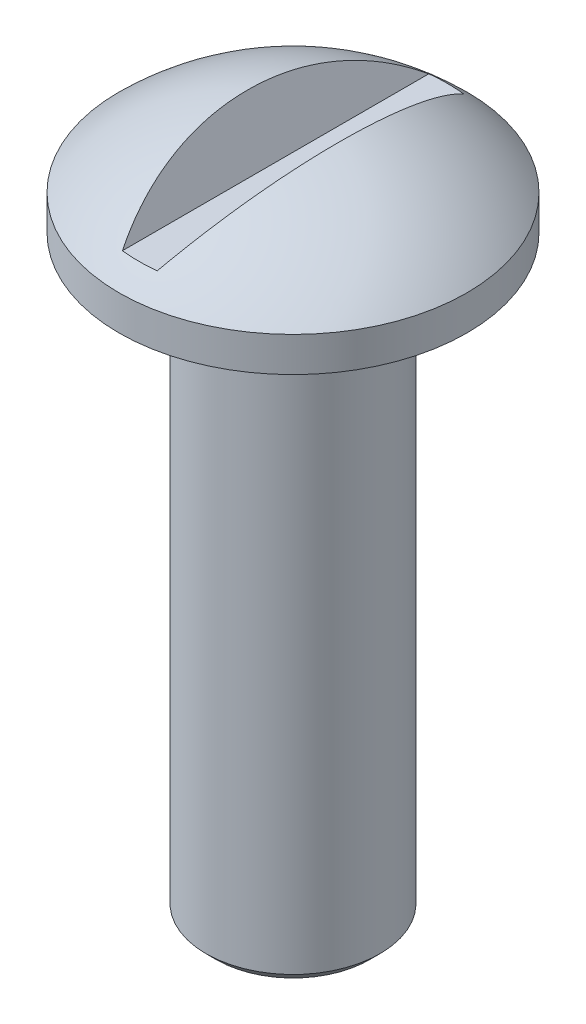
ISO-10303-21;
HEADER;
FILE_DESCRIPTION(('STEP AP214'),'2;1');
FILE_NAME('part.step','',(''),(''),'','','');
FILE_SCHEMA(('AUTOMOTIVE_DESIGN { 1 0 10303 214 1 1 1 1 }'));
ENDSEC;
DATA;
#1=APPLICATION_CONTEXT('core data for automotive mechanical design processes');
#2=APPLICATION_PROTOCOL_DEFINITION('international standard','automotive_design',2000,#1);
#3=PRODUCT_CONTEXT('',#1,'mechanical');
#4=PRODUCT('Part','Part','',(#3));
#5=PRODUCT_RELATED_PRODUCT_CATEGORY('part','',(#4));
#6=PRODUCT_DEFINITION_FORMATION('','',#4);
#7=PRODUCT_DEFINITION_CONTEXT('part definition',#1,'design');
#8=PRODUCT_DEFINITION('design','',#6,#7);
#9=PRODUCT_DEFINITION_SHAPE('','',#8);
#10=(LENGTH_UNIT() NAMED_UNIT(*) SI_UNIT(.MILLI.,.METRE.));
#11=(NAMED_UNIT(*) PLANE_ANGLE_UNIT() SI_UNIT($,.RADIAN.));
#12=(NAMED_UNIT(*) SI_UNIT($,.STERADIAN.) SOLID_ANGLE_UNIT());
#13=UNCERTAINTY_MEASURE_WITH_UNIT(LENGTH_MEASURE(1.E-05),#10,'distance_accuracy_value','');
#14=(GEOMETRIC_REPRESENTATION_CONTEXT(3) GLOBAL_UNCERTAINTY_ASSIGNED_CONTEXT((#13)) GLOBAL_UNIT_ASSIGNED_CONTEXT((#10,
#11,#12)) REPRESENTATION_CONTEXT('',''));
#15=CARTESIAN_POINT('',(0.,0.,0.));
#16=DIRECTION('',(0.,0.,1.));
#17=DIRECTION('',(1.,0.,0.));
#18=AXIS2_PLACEMENT_3D('',#15,#16,#17);
#19=CARTESIAN_POINT('',(0.,-10.1581751781052,0.));
#20=DIRECTION('',(0.,-1.,0.));
#21=DIRECTION('',(0.,0.,-1.));
#22=AXIS2_PLACEMENT_3D('',#19,#20,#21);
#23=DEGENERATE_TOROIDAL_SURFACE('',#22,0.25472992875793,17.78,.T.);
#24=CARTESIAN_POINT('',(0.,2.54,0.));
#25=DIRECTION('',(0.,-1.,0.));
#26=DIRECTION('',(0.,0.,-1.));
#27=AXIS2_PLACEMENT_3D('',#24,#25,#26);
#28=CIRCLE('',#27,12.7);
#29=CARTESIAN_POINT('',(0.,2.54,-12.7));
#30=VERTEX_POINT('',#29);
#31=EDGE_CURVE('E131',#30,#30,#28,.T.);
#32=ORIENTED_EDGE('',*,*,#31,.F.);
#33=EDGE_LOOP('',(#32));
#34=FACE_BOUND('',#33,.T.);
#35=CARTESIAN_POINT('',(-1.26883096853396,3.80797517810517,11.1864111993119));
#36=CARTESIAN_POINT('',(-1.42347276021877,4.07582261827674,10.8267974803934));
#37=CARTESIAN_POINT('',(-1.57046619824696,4.3304227213208,10.4540787824871));
#38=CARTESIAN_POINT('',(-1.84820938772054,4.81148803694528,9.68522218890252));
#39=CARTESIAN_POINT('',(-1.97896063963042,5.03795584840642,9.28908646150319));
#40=CARTESIAN_POINT('',(-2.22292123203513,5.46050798949597,8.47738400095323));
#41=CARTESIAN_POINT('',(-2.3361838952831,5.65668467684203,8.06188157164215));
#42=CARTESIAN_POINT('',(-2.4926739960017,5.9277334821682,7.42560613299783));
#43=CARTESIAN_POINT('',(-2.54260559247814,6.01421754416842,7.21133272371797));
#44=CARTESIAN_POINT('',(-2.63794414544133,6.17934876182076,6.77873424335938));
#45=CARTESIAN_POINT('',(-2.68334999701214,6.25799400370234,6.5604081982274));
#46=CARTESIAN_POINT('',(-2.81277225322966,6.48215992710129,5.89934502235263));
#47=CARTESIAN_POINT('',(-2.88985462598748,6.61567051308579,5.45108715456467));
#48=CARTESIAN_POINT('',(-3.02504316315355,6.84982392805834,4.54332429483763));
#49=CARTESIAN_POINT('',(-3.08314890147466,6.9504660190418,4.08381905060735));
#50=CARTESIAN_POINT('',(-3.18022266220742,7.11860270471272,3.15647063728677));
#51=CARTESIAN_POINT('',(-3.21917728472285,7.18607409009912,2.68862186680724));
#52=CARTESIAN_POINT('',(-3.27801541679004,7.28798472426193,1.74808156633599));
#53=CARTESIAN_POINT('',(-3.29789694040104,7.32242053328807,1.27538953722934));
#54=CARTESIAN_POINT('',(-3.31381614723032,7.34999340833258,0.55946472882301));
#55=CARTESIAN_POINT('',(-3.31675384536018,7.3550816507508,0.316766531961293));
#56=CARTESIAN_POINT('',(-3.31774742199012,7.35680257595506,-0.168665863024643));
#57=CARTESIAN_POINT('',(-3.31580336131507,7.35343536409287,-0.411400060662626));
#58=CARTESIAN_POINT('',(-3.30262273521215,7.33060585000705,-1.13904778834627));
#59=CARTESIAN_POINT('',(-3.28404020120777,7.2984199569781,-1.62351782350344));
#60=CARTESIAN_POINT('',(-3.22688182370829,7.19941874307079,-2.58778400369041));
#61=CARTESIAN_POINT('',(-3.18830215324768,7.13259679369376,-3.06757923616424));
#62=CARTESIAN_POINT('',(-3.0909837950158,6.96403645272694,-4.01892754744355));
#63=CARTESIAN_POINT('',(-3.03224613308829,6.8622998379507,-4.4904810443893));
#64=CARTESIAN_POINT('',(-2.89339235022734,6.62179803121239,-5.43151959055072));
#65=CARTESIAN_POINT('',(-2.81285676285247,6.48230630206172,-5.90075736629917));
#66=CARTESIAN_POINT('',(-2.6314853205003,6.16816174886571,-6.82338864478293));
#67=CARTESIAN_POINT('',(-2.53064533905391,5.99350177756626,-7.27677890480518));
#68=CARTESIAN_POINT('',(-2.30960426192462,5.61064740141858,-8.16326072799721));
#69=CARTESIAN_POINT('',(-2.18943721832486,5.40251197650844,-8.59638629371309));
#70=CARTESIAN_POINT('',(-1.93057009835064,4.95414097230407,-9.43960734072317));
#71=CARTESIAN_POINT('',(-1.79188193164166,4.71392602115555,-9.84971738302614));
#72=CARTESIAN_POINT('',(-1.58466061492596,4.35500817219263,-10.407859369777));
#73=CARTESIAN_POINT('',(-1.52339588609541,4.24889454914618,-10.5668490701742));
#74=CARTESIAN_POINT('',(-1.39815019390004,4.03196264683467,-10.8801300024231));
#75=CARTESIAN_POINT('',(-1.33417309803046,3.92115106626786,-11.0344274189524));
#76=CARTESIAN_POINT('',(-1.26883096853396,3.80797517810518,-11.1864111993119));
#77=B_SPLINE_CURVE_WITH_KNOTS('',3,(#35,#36,#37,#38,#39,#40,#41,#42,#43,#44,#45,#46,#47,#48,#49,
#50,#51,#52,#53,#54,#55,#56,#57,#58,#59,#60,#61,#62,#63,#64,#65,#66,#67,#68,#69,#70,#71,#72,#73,
#74,#75,#76),.UNSPECIFIED.,.F.,.F.,(4,2,2,2,2,2,2,2,2,2,2,2,2,2,2,2,2,2,2,2,4),(0.,
1.42246330577495,2.84479510551733,4.26270072849486,4.97172610332652,5.68092415787419,
7.1012007437598,8.52150921728075,9.94281006092002,11.3642588780492,12.0923968429781,
12.8205257356278,14.2764500532682,15.7326531023375,17.1887820559606,18.6752143922294,
20.1619491221205,21.6460925258543,23.1292861330814,23.7313636168075,24.3326097288373),.UNSPECIFIED.);
#78=CARTESIAN_POINT('',(-1.27,3.81,11.1836915168376));
#79=VERTEX_POINT('',#78);
#80=CARTESIAN_POINT('',(-1.27,3.81,-11.1836915168376));
#81=VERTEX_POINT('',#80);
#82=EDGE_CURVE('E83',#79,#81,#77,.T.);
#83=ORIENTED_EDGE('',*,*,#82,.T.);
#84=CARTESIAN_POINT('',(0.,3.81,0.));
#85=DIRECTION('',(0.,1.,0.));
#86=DIRECTION('',(0.,0.,1.));
#87=AXIS2_PLACEMENT_3D('',#84,#85,#86);
#88=CIRCLE('',#87,11.2555699963967);
#89=CARTESIAN_POINT('',(1.27,3.81,-11.1836915168376));
#90=VERTEX_POINT('',#89);
#91=EDGE_CURVE('E69',#81,#90,#88,.F.);
#92=ORIENTED_EDGE('',*,*,#91,.T.);
#93=CARTESIAN_POINT('',(1.26883096853396,3.80797517810517,-11.1864111993119));
#94=CARTESIAN_POINT('',(1.42347276021877,4.07582261827674,-10.8267974803934));
#95=CARTESIAN_POINT('',(1.57046619824696,4.3304227213208,-10.4540787824871));
#96=CARTESIAN_POINT('',(1.84820938772055,4.81148803694528,-9.68522218890252));
#97=CARTESIAN_POINT('',(1.97896063963042,5.03795584840642,-9.28908646150319));
#98=CARTESIAN_POINT('',(2.22292123203513,5.46050798949597,-8.47738400095323));
#99=CARTESIAN_POINT('',(2.3361838952831,5.65668467684203,-8.06188157164215));
#100=CARTESIAN_POINT('',(2.4926739960017,5.9277334821682,-7.42560613299783));
#101=CARTESIAN_POINT('',(2.54260559247814,6.01421754416842,-7.21133272371797));
#102=CARTESIAN_POINT('',(2.63794414544133,6.17934876182076,-6.77873424335938));
#103=CARTESIAN_POINT('',(2.68334999701214,6.25799400370234,-6.5604081982274));
#104=CARTESIAN_POINT('',(2.81277225322966,6.48215992710128,-5.89934502235263));
#105=CARTESIAN_POINT('',(2.88985462598748,6.61567051308579,-5.45108715456467));
#106=CARTESIAN_POINT('',(3.02504316315355,6.84982392805834,-4.54332429483763));
#107=CARTESIAN_POINT('',(3.08314890147466,6.9504660190418,-4.08381905060735));
#108=CARTESIAN_POINT('',(3.18022266220742,7.11860270471272,-3.15647063728678));
#109=CARTESIAN_POINT('',(3.21917728472285,7.18607409009912,-2.68862186680725));
#110=CARTESIAN_POINT('',(3.27801541679004,7.28798472426193,-1.748081566336));
#111=CARTESIAN_POINT('',(3.29789694040104,7.32242053328807,-1.27538953722935));
#112=CARTESIAN_POINT('',(3.31381614723032,7.34999340833258,-0.559464728823018));
#113=CARTESIAN_POINT('',(3.31675384536018,7.3550816507508,-0.316766531961302));
#114=CARTESIAN_POINT('',(3.31774742199012,7.35680257595506,0.168665863024634));
#115=CARTESIAN_POINT('',(3.31580336131507,7.35343536409287,0.411400060662617));
#116=CARTESIAN_POINT('',(3.30262273521215,7.33060585000705,1.13904778834626));
#117=CARTESIAN_POINT('',(3.28404020120777,7.2984199569781,1.62351782350343));
#118=CARTESIAN_POINT('',(3.22688182370829,7.19941874307079,2.5877840036904));
#119=CARTESIAN_POINT('',(3.18830215324769,7.13259679369377,3.06757923616423));
#120=CARTESIAN_POINT('',(3.0909837950158,6.96403645272695,4.01892754744354));
#121=CARTESIAN_POINT('',(3.03224613308829,6.8622998379507,4.49048104438928));
#122=CARTESIAN_POINT('',(2.89339235022734,6.6217980312124,5.43151959055071));
#123=CARTESIAN_POINT('',(2.81285676285248,6.48230630206172,5.90075736629916));
#124=CARTESIAN_POINT('',(2.63148532050031,6.16816174886572,6.82338864478292));
#125=CARTESIAN_POINT('',(2.53064533905392,5.99350177756627,7.27677890480517));
#126=CARTESIAN_POINT('',(2.30960426192463,5.61064740141859,8.1632607279972));
#127=CARTESIAN_POINT('',(2.18943721832486,5.40251197650845,8.59638629371308));
#128=CARTESIAN_POINT('',(1.93057009835064,4.95414097230408,9.43960734072316));
#129=CARTESIAN_POINT('',(1.79188193164167,4.71392602115555,9.84971738302613));
#130=CARTESIAN_POINT('',(1.58466061492597,4.35500817219264,10.4078593697769));
#131=CARTESIAN_POINT('',(1.52339588609541,4.24889454914619,10.5668490701742));
#132=CARTESIAN_POINT('',(1.39815019390004,4.03196264683467,10.8801300024231));
#133=CARTESIAN_POINT('',(1.33417309803047,3.92115106626786,11.0344274189524));
#134=CARTESIAN_POINT('',(1.26883096853396,3.80797517810517,11.1864111993119));
#135=B_SPLINE_CURVE_WITH_KNOTS('',3,(#93,#94,#95,#96,#97,#98,#99,#100,#101,#102,#103,#104,#105,
#106,#107,#108,#109,#110,#111,#112,#113,#114,#115,#116,#117,#118,#119,#120,#121,#122,#123,#124,
#125,#126,#127,#128,#129,#130,#131,#132,#133,#134),.UNSPECIFIED.,.F.,.F.,(4,2,2,2,2,2,2,2,2,2,2,
2,2,2,2,2,2,2,2,2,4),(0.,1.42246330577495,2.84479510551732,4.26270072849486,4.97172610332652,
5.68092415787419,7.1012007437598,8.52150921728074,9.94281006092001,11.3642588780492,
12.092396842978,12.8205257356278,14.2764500532681,15.7326531023375,17.1887820559606,
18.6752143922294,20.1619491221205,21.6460925258543,23.1292861330813,23.7313636168075,
24.3326097288373),.UNSPECIFIED.);
#136=CARTESIAN_POINT('',(1.27,3.81,11.1836915168376));
#137=VERTEX_POINT('',#136);
#138=EDGE_CURVE('E88',#90,#137,#135,.T.);
#139=ORIENTED_EDGE('',*,*,#138,.T.);
#140=EDGE_CURVE('E75',#137,#79,#88,.F.);
#141=ORIENTED_EDGE('',*,*,#140,.T.);
#142=EDGE_LOOP('',(#83,#92,#139,#141));
#143=FACE_BOUND('',#142,.T.);
#144=ADVANCED_FACE('F47',(#34,#143),#23,.T.);
#145=CARTESIAN_POINT('',(0.,7.62,0.));
#146=DIRECTION('',(0.,-1.,0.));
#147=DIRECTION('',(0.,0.,-1.));
#148=AXIS2_PLACEMENT_3D('',#145,#146,#147);
#149=CYLINDRICAL_SURFACE('',#148,12.7);
#150=CARTESIAN_POINT('',(0.,0.,0.));
#151=DIRECTION('',(0.,1.,0.));
#152=DIRECTION('',(0.,0.,1.));
#153=AXIS2_PLACEMENT_3D('',#150,#151,#152);
#154=CIRCLE('',#153,12.7);
#155=CARTESIAN_POINT('',(0.,0.,12.7));
#156=VERTEX_POINT('',#155);
#157=EDGE_CURVE('E134',#156,#156,#154,.T.);
#158=ORIENTED_EDGE('',*,*,#157,.T.);
#159=EDGE_LOOP('',(#158));
#160=FACE_BOUND('',#159,.T.);
#161=ORIENTED_EDGE('',*,*,#31,.T.);
#162=EDGE_LOOP('',(#161));
#163=FACE_BOUND('',#162,.T.);
#164=ADVANCED_FACE('F121',(#160,#163),#149,.T.);
#165=CARTESIAN_POINT('',(0.,-43.18,0.));
#166=DIRECTION('',(0.,1.,0.));
#167=DIRECTION('',(0.,0.,1.));
#168=AXIS2_PLACEMENT_3D('',#165,#166,#167);
#169=CYLINDRICAL_SURFACE('',#168,6.35);
#170=CARTESIAN_POINT('',(0.,-42.418,0.));
#171=DIRECTION('',(0.,1.,0.));
#172=DIRECTION('',(0.,0.,1.));
#173=AXIS2_PLACEMENT_3D('',#170,#171,#172);
#174=CIRCLE('',#173,6.35);
#175=CARTESIAN_POINT('',(0.,-42.418,6.35));
#176=VERTEX_POINT('',#175);
#177=EDGE_CURVE('E57',#176,#176,#174,.T.);
#178=ORIENTED_EDGE('',*,*,#177,.T.);
#179=EDGE_LOOP('',(#178));
#180=FACE_BOUND('',#179,.T.);
#181=CARTESIAN_POINT('',(0.,0.,0.));
#182=DIRECTION('',(0.,1.,0.));
#183=DIRECTION('',(0.,0.,1.));
#184=AXIS2_PLACEMENT_3D('',#181,#182,#183);
#185=CIRCLE('',#184,6.35);
#186=CARTESIAN_POINT('',(0.,0.,6.35));
#187=VERTEX_POINT('',#186);
#188=EDGE_CURVE('E84',#187,#187,#185,.T.);
#189=ORIENTED_EDGE('',*,*,#188,.F.);
#190=EDGE_LOOP('',(#189));
#191=FACE_BOUND('',#190,.T.);
#192=ADVANCED_FACE('F126',(#180,#191),#169,.T.);
#193=CARTESIAN_POINT('',(0.,-43.18,0.));
#194=DIRECTION('',(0.,1.,0.));
#195=DIRECTION('',(0.,0.,1.));
#196=AXIS2_PLACEMENT_3D('',#193,#194,#195);
#197=PLANE('',#196);
#198=CARTESIAN_POINT('',(0.,-43.18,0.));
#199=DIRECTION('',(0.,1.,0.));
#200=DIRECTION('',(0.,0.,1.));
#201=AXIS2_PLACEMENT_3D('',#198,#199,#200);
#202=CIRCLE('',#201,5.588);
#203=CARTESIAN_POINT('',(0.,-43.18,5.588));
#204=VERTEX_POINT('',#203);
#205=EDGE_CURVE('E11',#204,#204,#202,.F.);
#206=ORIENTED_EDGE('',*,*,#205,.T.);
#207=EDGE_LOOP('',(#206));
#208=FACE_BOUND('',#207,.T.);
#209=ADVANCED_FACE('F149',(#208),#197,.F.);
#210=CARTESIAN_POINT('',(0.,0.,0.));
#211=DIRECTION('',(0.,1.,0.));
#212=DIRECTION('',(0.,0.,1.));
#213=AXIS2_PLACEMENT_3D('',#210,#211,#212);
#214=PLANE('',#213);
#215=ORIENTED_EDGE('',*,*,#188,.T.);
#216=EDGE_LOOP('',(#215));
#217=FACE_BOUND('',#216,.T.);
#218=ORIENTED_EDGE('',*,*,#157,.F.);
#219=EDGE_LOOP('',(#218));
#220=FACE_BOUND('',#219,.T.);
#221=ADVANCED_FACE('F113',(#217,#220),#214,.F.);
#222=CARTESIAN_POINT('',(1.27,3.81,-16.9141652403668));
#223=DIRECTION('',(0.866025403784438,-0.500000000000001,0.));
#224=DIRECTION('',(0.500000000000001,0.866025403784438,0.));
#225=AXIS2_PLACEMENT_3D('',#222,#223,#224);
#226=PLANE('',#225);
#227=DIRECTION('',(0.,0.,-1.));
#228=VECTOR('',#227,1.);
#229=CARTESIAN_POINT('',(1.27,3.81,-16.9141652403668));
#230=LINE('',#229,#228);
#231=EDGE_CURVE('E78',#137,#90,#230,.T.);
#232=ORIENTED_EDGE('',*,*,#231,.F.);
#233=ORIENTED_EDGE('',*,*,#138,.F.);
#234=EDGE_LOOP('',(#232,#233));
#235=FACE_BOUND('',#234,.T.);
#236=ADVANCED_FACE('F87',(#235),#226,.F.);
#237=CARTESIAN_POINT('',(-1.27,3.81,-16.9141652403668));
#238=DIRECTION('',(-0.866025403784438,-0.500000000000001,0.));
#239=DIRECTION('',(0.500000000000001,-0.866025403784438,0.));
#240=AXIS2_PLACEMENT_3D('',#237,#238,#239);
#241=PLANE('',#240);
#242=DIRECTION('',(0.,0.,1.));
#243=VECTOR('',#242,1.);
#244=CARTESIAN_POINT('',(-1.27,3.81,-16.9141652403668));
#245=LINE('',#244,#243);
#246=EDGE_CURVE('E64',#81,#79,#245,.T.);
#247=ORIENTED_EDGE('',*,*,#246,.F.);
#248=ORIENTED_EDGE('',*,*,#82,.F.);
#249=EDGE_LOOP('',(#247,#248));
#250=FACE_BOUND('',#249,.T.);
#251=ADVANCED_FACE('F112',(#250),#241,.F.);
#252=CARTESIAN_POINT('',(0.,3.81,0.));
#253=DIRECTION('',(0.,1.,0.));
#254=DIRECTION('',(0.,0.,1.));
#255=AXIS2_PLACEMENT_3D('',#252,#253,#254);
#256=PLANE('',#255);
#257=ORIENTED_EDGE('',*,*,#246,.T.);
#258=ORIENTED_EDGE('',*,*,#140,.F.);
#259=ORIENTED_EDGE('',*,*,#231,.T.);
#260=ORIENTED_EDGE('',*,*,#91,.F.);
#261=EDGE_LOOP('',(#257,#258,#259,#260));
#262=FACE_BOUND('',#261,.T.);
#263=ADVANCED_FACE('F77',(#262),#256,.T.);
#264=CARTESIAN_POINT('',(0.,-42.418,0.));
#265=DIRECTION('',(0.,1.,0.));
#266=DIRECTION('',(0.,0.,1.));
#267=AXIS2_PLACEMENT_3D('',#264,#265,#266);
#268=CONICAL_SURFACE('',#267,6.35,0.785398163397447);
#269=ORIENTED_EDGE('',*,*,#205,.F.);
#270=EDGE_LOOP('',(#269));
#271=FACE_BOUND('',#270,.T.);
#272=ORIENTED_EDGE('',*,*,#177,.F.);
#273=EDGE_LOOP('',(#272));
#274=FACE_BOUND('',#273,.T.);
#275=ADVANCED_FACE('F50',(#271,#274),#268,.T.);
#276=CLOSED_SHELL('',(#144,#164,#192,#209,#221,#236,#251,#263,#275));
#277=MANIFOLD_SOLID_BREP('B2',#276);
#278=ADVANCED_BREP_SHAPE_REPRESENTATION('',(#18,#277),#14);
#279=SHAPE_DEFINITION_REPRESENTATION(#9,#278);
ENDSEC;
END-ISO-10303-21;
